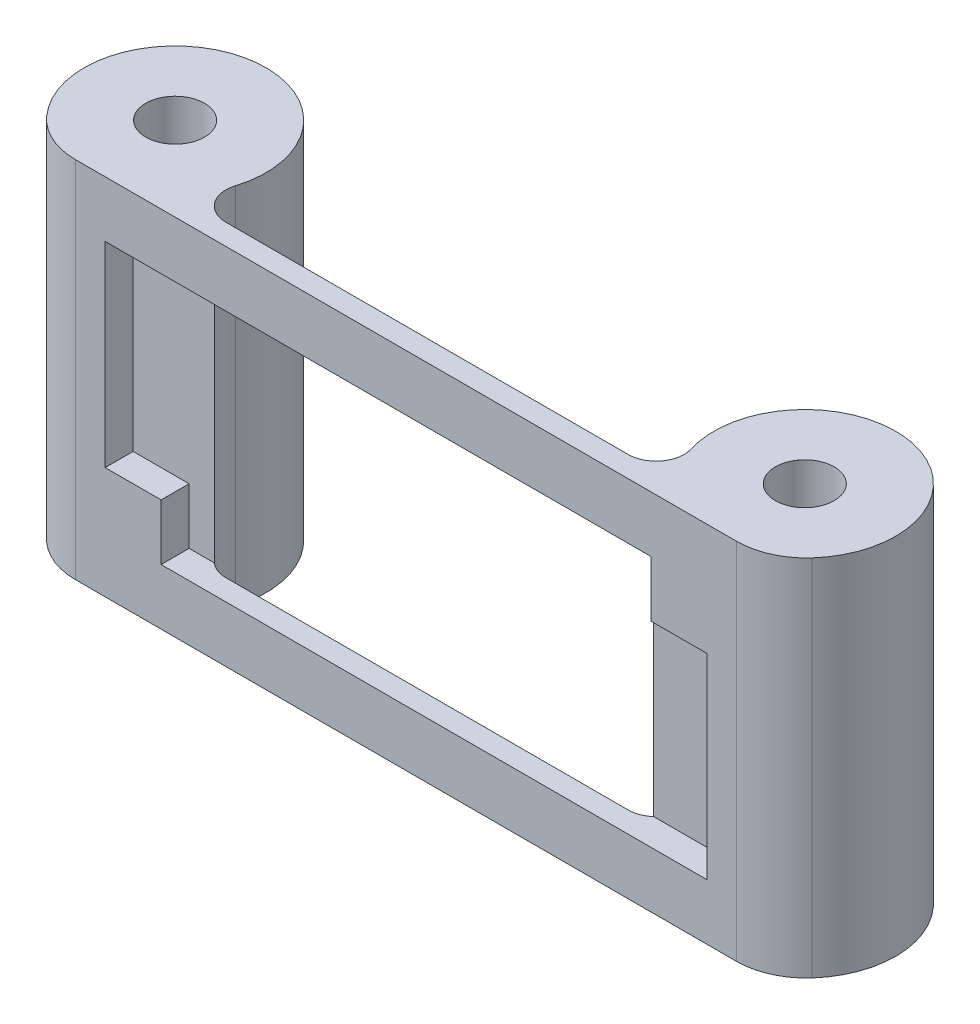
ISO-10303-21;
HEADER;
FILE_DESCRIPTION(('STEP AP214'),'2;1');
FILE_NAME('part.step','',(''),(''),'','','');
FILE_SCHEMA(('AUTOMOTIVE_DESIGN { 1 0 10303 214 1 1 1 1 }'));
ENDSEC;
DATA;
#1=APPLICATION_CONTEXT('core data for automotive mechanical design processes');
#2=APPLICATION_PROTOCOL_DEFINITION('international standard','automotive_design',2000,#1);
#3=PRODUCT_CONTEXT('',#1,'mechanical');
#4=PRODUCT('Part','Part','',(#3));
#5=PRODUCT_RELATED_PRODUCT_CATEGORY('part','',(#4));
#6=PRODUCT_DEFINITION_FORMATION('','',#4);
#7=PRODUCT_DEFINITION_CONTEXT('part definition',#1,'design');
#8=PRODUCT_DEFINITION('design','',#6,#7);
#9=PRODUCT_DEFINITION_SHAPE('','',#8);
#10=(LENGTH_UNIT() NAMED_UNIT(*) SI_UNIT(.MILLI.,.METRE.));
#11=(NAMED_UNIT(*) PLANE_ANGLE_UNIT() SI_UNIT($,.RADIAN.));
#12=(NAMED_UNIT(*) SI_UNIT($,.STERADIAN.) SOLID_ANGLE_UNIT());
#13=UNCERTAINTY_MEASURE_WITH_UNIT(LENGTH_MEASURE(1.E-05),#10,'distance_accuracy_value','');
#14=(GEOMETRIC_REPRESENTATION_CONTEXT(3) GLOBAL_UNCERTAINTY_ASSIGNED_CONTEXT((#13)) GLOBAL_UNIT_ASSIGNED_CONTEXT((#10,
#11,#12)) REPRESENTATION_CONTEXT('',''));
#15=CARTESIAN_POINT('',(0.,0.,0.));
#16=DIRECTION('',(0.,0.,1.));
#17=DIRECTION('',(1.,0.,0.));
#18=AXIS2_PLACEMENT_3D('',#15,#16,#17);
#19=CARTESIAN_POINT('',(0.,0.,4.5));
#20=DIRECTION('',(0.,0.,1.));
#21=DIRECTION('',(1.,0.,0.));
#22=AXIS2_PLACEMENT_3D('',#19,#20,#21);
#23=PLANE('',#22);
#24=DIRECTION('',(0.,1.,0.));
#25=VECTOR('',#24,1.);
#26=CARTESIAN_POINT('',(36.875961595364,0.,4.5));
#27=LINE('',#26,#25);
#28=CARTESIAN_POINT('',(36.875961595364,26.,4.5));
#29=VERTEX_POINT('',#28);
#30=CARTESIAN_POINT('',(36.875961595364,22.,4.5));
#31=VERTEX_POINT('',#30);
#32=EDGE_CURVE('E274',#29,#31,#27,.F.);
#33=ORIENTED_EDGE('',*,*,#32,.T.);
#34=DIRECTION('',(-1.,0.,0.));
#35=VECTOR('',#34,1.);
#36=CARTESIAN_POINT('',(0.,22.,4.5));
#37=LINE('',#36,#35);
#38=CARTESIAN_POINT('',(8.12403840463595,22.,4.5));
#39=VERTEX_POINT('',#38);
#40=EDGE_CURVE('E233',#31,#39,#37,.T.);
#41=ORIENTED_EDGE('',*,*,#40,.T.);
#42=DIRECTION('',(0.,1.,0.));
#43=VECTOR('',#42,1.);
#44=CARTESIAN_POINT('',(8.12403840463596,26.,4.5));
#45=LINE('',#44,#43);
#46=CARTESIAN_POINT('',(8.12403840463595,26.,4.5));
#47=VERTEX_POINT('',#46);
#48=EDGE_CURVE('E277',#39,#47,#45,.T.);
#49=ORIENTED_EDGE('',*,*,#48,.T.);
#50=DIRECTION('',(-1.,0.,0.));
#51=VECTOR('',#50,1.);
#52=CARTESIAN_POINT('',(-2.5,26.,4.5));
#53=LINE('',#52,#51);
#54=EDGE_CURVE('E252',#29,#47,#53,.T.);
#55=ORIENTED_EDGE('',*,*,#54,.F.);
#56=EDGE_LOOP('',(#33,#41,#49,#55));
#57=FACE_BOUND('',#56,.T.);
#58=ADVANCED_FACE('F17',(#57),#23,.F.);
#59=CARTESIAN_POINT('',(8.12403840463595,0.,4.5));
#60=VERTEX_POINT('',#59);
#61=CARTESIAN_POINT('',(8.12403840463595,4.,4.5));
#62=VERTEX_POINT('',#61);
#63=EDGE_CURVE('E278',#60,#62,#45,.T.);
#64=ORIENTED_EDGE('',*,*,#63,.T.);
#65=DIRECTION('',(1.,0.,0.));
#66=VECTOR('',#65,1.);
#67=CARTESIAN_POINT('',(0.,4.,4.5));
#68=LINE('',#67,#66);
#69=CARTESIAN_POINT('',(36.875961595364,4.,4.5));
#70=VERTEX_POINT('',#69);
#71=EDGE_CURVE('E227',#62,#70,#68,.T.);
#72=ORIENTED_EDGE('',*,*,#71,.T.);
#73=CARTESIAN_POINT('',(36.875961595364,0.,4.5));
#74=VERTEX_POINT('',#73);
#75=EDGE_CURVE('E271',#70,#74,#27,.F.);
#76=ORIENTED_EDGE('',*,*,#75,.T.);
#77=DIRECTION('',(1.,0.,0.));
#78=VECTOR('',#77,1.);
#79=CARTESIAN_POINT('',(-2.5,0.,4.5));
#80=LINE('',#79,#78);
#81=EDGE_CURVE('E248',#60,#74,#80,.T.);
#82=ORIENTED_EDGE('',*,*,#81,.F.);
#83=EDGE_LOOP('',(#64,#72,#76,#82));
#84=FACE_BOUND('',#83,.T.);
#85=ADVANCED_FACE('F326',(#84),#23,.F.);
#86=CARTESIAN_POINT('',(0.,26.,0.));
#87=DIRECTION('',(0.,-1.,0.));
#88=DIRECTION('',(0.,0.,-1.));
#89=AXIS2_PLACEMENT_3D('',#86,#87,#88);
#90=CYLINDRICAL_SURFACE('',#89,6.5);
#91=CARTESIAN_POINT('',(0.,0.,0.));
#92=DIRECTION('',(0.,1.,0.));
#93=DIRECTION('',(0.,0.,1.));
#94=AXIS2_PLACEMENT_3D('',#91,#92,#93);
#95=CIRCLE('',#94,6.5);
#96=CARTESIAN_POINT('',(6.21249995648632,0.,1.91176470588236));
#97=VERTEX_POINT('',#96);
#98=CARTESIAN_POINT('',(-4.84481395124954,0.,4.33333333333334));
#99=VERTEX_POINT('',#98);
#100=EDGE_CURVE('E265',#97,#99,#95,.T.);
#101=ORIENTED_EDGE('',*,*,#100,.T.);
#102=DIRECTION('',(0.,-1.,0.));
#103=VECTOR('',#102,1.);
#104=CARTESIAN_POINT('',(-4.84481395124954,26.,4.33333333333334));
#105=LINE('',#104,#103);
#106=CARTESIAN_POINT('',(-4.84481395124954,26.,4.33333333333334));
#107=VERTEX_POINT('',#106);
#108=EDGE_CURVE('E311',#99,#107,#105,.F.);
#109=ORIENTED_EDGE('',*,*,#108,.T.);
#110=CARTESIAN_POINT('',(0.,26.,0.));
#111=DIRECTION('',(0.,1.,0.));
#112=DIRECTION('',(0.,0.,1.));
#113=AXIS2_PLACEMENT_3D('',#110,#111,#112);
#114=CIRCLE('',#113,6.5);
#115=CARTESIAN_POINT('',(6.21249995648632,26.,1.91176470588236));
#116=VERTEX_POINT('',#115);
#117=EDGE_CURVE('E268',#116,#107,#114,.T.);
#118=ORIENTED_EDGE('',*,*,#117,.F.);
#119=DIRECTION('',(0.,-1.,0.));
#120=VECTOR('',#119,1.);
#121=CARTESIAN_POINT('',(6.21249995648632,26.,1.91176470588236));
#122=LINE('',#121,#120);
#123=EDGE_CURVE('E281',#116,#97,#122,.T.);
#124=ORIENTED_EDGE('',*,*,#123,.T.);
#125=EDGE_LOOP('',(#101,#109,#118,#124));
#126=FACE_BOUND('',#125,.T.);
#127=ADVANCED_FACE('F381',(#126),#90,.T.);
#128=CARTESIAN_POINT('',(0.,26.,0.));
#129=DIRECTION('',(0.,1.,0.));
#130=DIRECTION('',(0.,0.,1.));
#131=AXIS2_PLACEMENT_3D('',#128,#129,#130);
#132=PLANE('',#131);
#133=DIRECTION('',(1.,0.,0.));
#134=VECTOR('',#133,1.);
#135=CARTESIAN_POINT('',(0.,26.,6.));
#136=LINE('',#135,#134);
#137=CARTESIAN_POINT('',(-1.11803398874989,26.,6.));
#138=VERTEX_POINT('',#137);
#139=CARTESIAN_POINT('',(46.1180339887499,26.,6.));
#140=VERTEX_POINT('',#139);
#141=EDGE_CURVE('E258',#138,#140,#136,.T.);
#142=ORIENTED_EDGE('',*,*,#141,.T.);
#143=CARTESIAN_POINT('',(46.1180339887499,26.,1.));
#144=DIRECTION('',(0.,1.,0.));
#145=DIRECTION('',(0.,0.,1.));
#146=AXIS2_PLACEMENT_3D('',#143,#144,#145);
#147=CIRCLE('',#146,5.);
#148=CARTESIAN_POINT('',(49.8448139512495,26.,4.33333333333334));
#149=VERTEX_POINT('',#148);
#150=EDGE_CURVE('E303',#140,#149,#147,.T.);
#151=ORIENTED_EDGE('',*,*,#150,.T.);
#152=CARTESIAN_POINT('',(45.,26.,0.));
#153=DIRECTION('',(0.,1.,0.));
#154=DIRECTION('',(0.,0.,1.));
#155=AXIS2_PLACEMENT_3D('',#152,#153,#154);
#156=CIRCLE('',#155,6.5);
#157=CARTESIAN_POINT('',(38.7875000435137,26.,1.91176470588236));
#158=VERTEX_POINT('',#157);
#159=EDGE_CURVE('E246',#149,#158,#156,.T.);
#160=ORIENTED_EDGE('',*,*,#159,.T.);
#161=CARTESIAN_POINT('',(36.875961595364,26.,2.5));
#162=DIRECTION('',(0.,1.,0.));
#163=DIRECTION('',(0.,0.,1.));
#164=AXIS2_PLACEMENT_3D('',#161,#162,#163);
#165=CIRCLE('',#164,2.);
#166=EDGE_CURVE('E290',#158,#29,#165,.F.);
#167=ORIENTED_EDGE('',*,*,#166,.T.);
#168=ORIENTED_EDGE('',*,*,#54,.T.);
#169=CARTESIAN_POINT('',(8.12403840463596,26.,2.5));
#170=DIRECTION('',(0.,1.,0.));
#171=DIRECTION('',(0.,0.,1.));
#172=AXIS2_PLACEMENT_3D('',#169,#170,#171);
#173=CIRCLE('',#172,2.);
#174=EDGE_CURVE('E286',#47,#116,#173,.F.);
#175=ORIENTED_EDGE('',*,*,#174,.T.);
#176=ORIENTED_EDGE('',*,*,#117,.T.);
#177=CARTESIAN_POINT('',(-1.11803398874989,26.,1.));
#178=DIRECTION('',(0.,1.,0.));
#179=DIRECTION('',(0.,0.,1.));
#180=AXIS2_PLACEMENT_3D('',#177,#178,#179);
#181=CIRCLE('',#180,5.);
#182=EDGE_CURVE('E301',#107,#138,#181,.T.);
#183=ORIENTED_EDGE('',*,*,#182,.T.);
#184=EDGE_LOOP('',(#142,#151,#160,#167,#168,#175,#176,#183));
#185=FACE_BOUND('',#184,.T.);
#186=CARTESIAN_POINT('',(45.,26.,0.));
#187=DIRECTION('',(0.,1.,0.));
#188=DIRECTION('',(0.,0.,1.));
#189=AXIS2_PLACEMENT_3D('',#186,#187,#188);
#190=CIRCLE('',#189,2.1);
#191=CARTESIAN_POINT('',(45.,26.,2.1));
#192=VERTEX_POINT('',#191);
#193=EDGE_CURVE('E240',#192,#192,#190,.T.);
#194=ORIENTED_EDGE('',*,*,#193,.F.);
#195=EDGE_LOOP('',(#194));
#196=FACE_BOUND('',#195,.T.);
#197=CARTESIAN_POINT('',(0.,26.,0.));
#198=DIRECTION('',(0.,1.,0.));
#199=DIRECTION('',(0.,0.,1.));
#200=AXIS2_PLACEMENT_3D('',#197,#198,#199);
#201=CIRCLE('',#200,2.1);
#202=CARTESIAN_POINT('',(0.,26.,2.1));
#203=VERTEX_POINT('',#202);
#204=EDGE_CURVE('E262',#203,#203,#201,.T.);
#205=ORIENTED_EDGE('',*,*,#204,.F.);
#206=EDGE_LOOP('',(#205));
#207=FACE_BOUND('',#206,.T.);
#208=ADVANCED_FACE('F364',(#185,#196,#207),#132,.T.);
#209=CARTESIAN_POINT('',(0.,0.,0.));
#210=DIRECTION('',(0.,1.,0.));
#211=DIRECTION('',(0.,0.,1.));
#212=AXIS2_PLACEMENT_3D('',#209,#210,#211);
#213=PLANE('',#212);
#214=CARTESIAN_POINT('',(45.,0.,0.));
#215=DIRECTION('',(0.,1.,0.));
#216=DIRECTION('',(0.,0.,1.));
#217=AXIS2_PLACEMENT_3D('',#214,#215,#216);
#218=CIRCLE('',#217,6.5);
#219=CARTESIAN_POINT('',(49.8448139512495,0.,4.33333333333334));
#220=VERTEX_POINT('',#219);
#221=CARTESIAN_POINT('',(38.7875000435137,0.,1.91176470588236));
#222=VERTEX_POINT('',#221);
#223=EDGE_CURVE('E243',#220,#222,#218,.T.);
#224=ORIENTED_EDGE('',*,*,#223,.F.);
#225=CARTESIAN_POINT('',(46.1180339887499,0.,1.));
#226=DIRECTION('',(0.,1.,0.));
#227=DIRECTION('',(0.,0.,1.));
#228=AXIS2_PLACEMENT_3D('',#225,#226,#227);
#229=CIRCLE('',#228,5.);
#230=CARTESIAN_POINT('',(46.1180339887499,0.,6.));
#231=VERTEX_POINT('',#230);
#232=EDGE_CURVE('E309',#220,#231,#229,.F.);
#233=ORIENTED_EDGE('',*,*,#232,.T.);
#234=DIRECTION('',(1.,0.,0.));
#235=VECTOR('',#234,1.);
#236=CARTESIAN_POINT('',(0.,0.,6.));
#237=LINE('',#236,#235);
#238=CARTESIAN_POINT('',(-1.11803398874989,0.,6.));
#239=VERTEX_POINT('',#238);
#240=EDGE_CURVE('E255',#239,#231,#237,.T.);
#241=ORIENTED_EDGE('',*,*,#240,.F.);
#242=CARTESIAN_POINT('',(-1.11803398874989,0.,1.));
#243=DIRECTION('',(0.,1.,0.));
#244=DIRECTION('',(0.,0.,1.));
#245=AXIS2_PLACEMENT_3D('',#242,#243,#244);
#246=CIRCLE('',#245,5.);
#247=EDGE_CURVE('E307',#239,#99,#246,.F.);
#248=ORIENTED_EDGE('',*,*,#247,.T.);
#249=ORIENTED_EDGE('',*,*,#100,.F.);
#250=CARTESIAN_POINT('',(8.12403840463596,0.,2.5));
#251=DIRECTION('',(0.,1.,0.));
#252=DIRECTION('',(0.,0.,1.));
#253=AXIS2_PLACEMENT_3D('',#250,#251,#252);
#254=CIRCLE('',#253,2.);
#255=EDGE_CURVE('E288',#97,#60,#254,.T.);
#256=ORIENTED_EDGE('',*,*,#255,.T.);
#257=ORIENTED_EDGE('',*,*,#81,.T.);
#258=CARTESIAN_POINT('',(36.875961595364,0.,2.5));
#259=DIRECTION('',(0.,1.,0.));
#260=DIRECTION('',(0.,0.,1.));
#261=AXIS2_PLACEMENT_3D('',#258,#259,#260);
#262=CIRCLE('',#261,2.);
#263=EDGE_CURVE('E292',#74,#222,#262,.T.);
#264=ORIENTED_EDGE('',*,*,#263,.T.);
#265=EDGE_LOOP('',(#224,#233,#241,#248,#249,#256,#257,#264));
#266=FACE_BOUND('',#265,.T.);
#267=CARTESIAN_POINT('',(45.,0.,0.));
#268=DIRECTION('',(0.,1.,0.));
#269=DIRECTION('',(0.,0.,1.));
#270=AXIS2_PLACEMENT_3D('',#267,#268,#269);
#271=CIRCLE('',#270,2.1);
#272=CARTESIAN_POINT('',(45.,0.,2.1));
#273=VERTEX_POINT('',#272);
#274=EDGE_CURVE('E239',#273,#273,#271,.T.);
#275=ORIENTED_EDGE('',*,*,#274,.T.);
#276=EDGE_LOOP('',(#275));
#277=FACE_BOUND('',#276,.T.);
#278=CARTESIAN_POINT('',(0.,0.,0.));
#279=DIRECTION('',(0.,1.,0.));
#280=DIRECTION('',(0.,0.,1.));
#281=AXIS2_PLACEMENT_3D('',#278,#279,#280);
#282=CIRCLE('',#281,2.1);
#283=CARTESIAN_POINT('',(0.,0.,2.1));
#284=VERTEX_POINT('',#283);
#285=EDGE_CURVE('E261',#284,#284,#282,.T.);
#286=ORIENTED_EDGE('',*,*,#285,.T.);
#287=EDGE_LOOP('',(#286));
#288=FACE_BOUND('',#287,.T.);
#289=ADVANCED_FACE('F375',(#266,#277,#288),#213,.F.);
#290=CARTESIAN_POINT('',(0.,26.,0.));
#291=DIRECTION('',(0.,-1.,0.));
#292=DIRECTION('',(0.,0.,-1.));
#293=AXIS2_PLACEMENT_3D('',#290,#291,#292);
#294=CYLINDRICAL_SURFACE('',#293,2.1);
#295=ORIENTED_EDGE('',*,*,#204,.T.);
#296=EDGE_LOOP('',(#295));
#297=FACE_BOUND('',#296,.T.);
#298=ORIENTED_EDGE('',*,*,#285,.F.);
#299=EDGE_LOOP('',(#298));
#300=FACE_BOUND('',#299,.T.);
#301=ADVANCED_FACE('F406',(#297,#300),#294,.F.);
#302=CARTESIAN_POINT('',(-23.2632016672056,52.,6.));
#303=DIRECTION('',(0.,0.,1.));
#304=DIRECTION('',(1.,0.,0.));
#305=AXIS2_PLACEMENT_3D('',#302,#303,#304);
#306=PLANE('',#305);
#307=DIRECTION('',(0.,-1.,0.));
#308=VECTOR('',#307,1.);
#309=CARTESIAN_POINT('',(1.,22.,6.));
#310=LINE('',#309,#308);
#311=CARTESIAN_POINT('',(1.,22.,6.));
#312=VERTEX_POINT('',#311);
#313=CARTESIAN_POINT('',(1.,8.,6.));
#314=VERTEX_POINT('',#313);
#315=EDGE_CURVE('E32',#312,#314,#310,.T.);
#316=ORIENTED_EDGE('',*,*,#315,.F.);
#317=DIRECTION('',(-1.,0.,0.));
#318=VECTOR('',#317,1.);
#319=CARTESIAN_POINT('',(1.,22.,6.));
#320=LINE('',#319,#318);
#321=CARTESIAN_POINT('',(40.,22.,6.));
#322=VERTEX_POINT('',#321);
#323=EDGE_CURVE('E175',#322,#312,#320,.T.);
#324=ORIENTED_EDGE('',*,*,#323,.F.);
#325=DIRECTION('',(0.,1.,0.));
#326=VECTOR('',#325,1.);
#327=CARTESIAN_POINT('',(40.,22.,6.));
#328=LINE('',#327,#326);
#329=CARTESIAN_POINT('',(40.,18.,6.));
#330=VERTEX_POINT('',#329);
#331=EDGE_CURVE('E178',#330,#322,#328,.T.);
#332=ORIENTED_EDGE('',*,*,#331,.F.);
#333=DIRECTION('',(-1.,0.,0.));
#334=VECTOR('',#333,1.);
#335=CARTESIAN_POINT('',(40.,18.,6.));
#336=LINE('',#335,#334);
#337=CARTESIAN_POINT('',(44.,18.,6.));
#338=VERTEX_POINT('',#337);
#339=EDGE_CURVE('E207',#338,#330,#336,.T.);
#340=ORIENTED_EDGE('',*,*,#339,.F.);
#341=DIRECTION('',(0.,1.,0.));
#342=VECTOR('',#341,1.);
#343=CARTESIAN_POINT('',(44.,18.,6.));
#344=LINE('',#343,#342);
#345=CARTESIAN_POINT('',(44.,4.,6.));
#346=VERTEX_POINT('',#345);
#347=EDGE_CURVE('E204',#346,#338,#344,.T.);
#348=ORIENTED_EDGE('',*,*,#347,.F.);
#349=DIRECTION('',(1.,0.,0.));
#350=VECTOR('',#349,1.);
#351=CARTESIAN_POINT('',(5.,4.,6.));
#352=LINE('',#351,#350);
#353=CARTESIAN_POINT('',(5.,4.,6.));
#354=VERTEX_POINT('',#353);
#355=EDGE_CURVE('E201',#354,#346,#352,.T.);
#356=ORIENTED_EDGE('',*,*,#355,.F.);
#357=DIRECTION('',(0.,-1.,0.));
#358=VECTOR('',#357,1.);
#359=CARTESIAN_POINT('',(5.,8.,6.));
#360=LINE('',#359,#358);
#361=CARTESIAN_POINT('',(5.,8.,6.));
#362=VERTEX_POINT('',#361);
#363=EDGE_CURVE('E198',#362,#354,#360,.T.);
#364=ORIENTED_EDGE('',*,*,#363,.F.);
#365=DIRECTION('',(1.,0.,0.));
#366=VECTOR('',#365,1.);
#367=CARTESIAN_POINT('',(1.,8.,6.));
#368=LINE('',#367,#366);
#369=EDGE_CURVE('E196',#314,#362,#368,.T.);
#370=ORIENTED_EDGE('',*,*,#369,.F.);
#371=EDGE_LOOP('',(#316,#324,#332,#340,#348,#356,#364,#370));
#372=FACE_BOUND('',#371,.T.);
#373=ORIENTED_EDGE('',*,*,#240,.T.);
#374=DIRECTION('',(0.,1.,0.));
#375=VECTOR('',#374,1.);
#376=CARTESIAN_POINT('',(46.1180339887499,26.,6.));
#377=LINE('',#376,#375);
#378=EDGE_CURVE('E298',#231,#140,#377,.T.);
#379=ORIENTED_EDGE('',*,*,#378,.T.);
#380=ORIENTED_EDGE('',*,*,#141,.F.);
#381=DIRECTION('',(0.,1.,0.));
#382=VECTOR('',#381,1.);
#383=CARTESIAN_POINT('',(-1.11803398874989,0.,6.));
#384=LINE('',#383,#382);
#385=EDGE_CURVE('E295',#138,#239,#384,.F.);
#386=ORIENTED_EDGE('',*,*,#385,.T.);
#387=EDGE_LOOP('',(#373,#379,#380,#386));
#388=FACE_BOUND('',#387,.T.);
#389=ADVANCED_FACE('F343',(#372,#388),#306,.T.);
#390=CARTESIAN_POINT('',(45.,26.,0.));
#391=DIRECTION('',(0.,-1.,0.));
#392=DIRECTION('',(0.,0.,-1.));
#393=AXIS2_PLACEMENT_3D('',#390,#391,#392);
#394=CYLINDRICAL_SURFACE('',#393,6.5);
#395=ORIENTED_EDGE('',*,*,#159,.F.);
#396=DIRECTION('',(0.,-1.,0.));
#397=VECTOR('',#396,1.);
#398=CARTESIAN_POINT('',(49.8448139512495,26.,4.33333333333334));
#399=LINE('',#398,#397);
#400=EDGE_CURVE('E305',#149,#220,#399,.T.);
#401=ORIENTED_EDGE('',*,*,#400,.T.);
#402=ORIENTED_EDGE('',*,*,#223,.T.);
#403=DIRECTION('',(0.,-1.,0.));
#404=VECTOR('',#403,1.);
#405=CARTESIAN_POINT('',(38.7875000435137,26.,1.91176470588236));
#406=LINE('',#405,#404);
#407=EDGE_CURVE('E283',#222,#158,#406,.F.);
#408=ORIENTED_EDGE('',*,*,#407,.T.);
#409=EDGE_LOOP('',(#395,#401,#402,#408));
#410=FACE_BOUND('',#409,.T.);
#411=ADVANCED_FACE('F370',(#410),#394,.T.);
#412=CARTESIAN_POINT('',(45.,26.,0.));
#413=DIRECTION('',(0.,-1.,0.));
#414=DIRECTION('',(0.,0.,-1.));
#415=AXIS2_PLACEMENT_3D('',#412,#413,#414);
#416=CYLINDRICAL_SURFACE('',#415,2.1);
#417=ORIENTED_EDGE('',*,*,#193,.T.);
#418=EDGE_LOOP('',(#417));
#419=FACE_BOUND('',#418,.T.);
#420=ORIENTED_EDGE('',*,*,#274,.F.);
#421=EDGE_LOOP('',(#420));
#422=FACE_BOUND('',#421,.T.);
#423=ADVANCED_FACE('F417',(#419,#422),#416,.F.);
#424=CARTESIAN_POINT('',(8.12403840463596,26.,2.5));
#425=DIRECTION('',(0.,-1.,0.));
#426=DIRECTION('',(0.,0.,-1.));
#427=AXIS2_PLACEMENT_3D('',#424,#425,#426);
#428=CYLINDRICAL_SURFACE('',#427,2.);
#429=ORIENTED_EDGE('',*,*,#48,.F.);
#430=CARTESIAN_POINT('',(8.12403840463596,22.,2.5));
#431=DIRECTION('',(0.,1.,0.));
#432=DIRECTION('',(0.,0.,1.));
#433=AXIS2_PLACEMENT_3D('',#430,#431,#432);
#434=CIRCLE('',#433,2.);
#435=CARTESIAN_POINT('',(6.80116274910366,22.,4.));
#436=VERTEX_POINT('',#435);
#437=EDGE_CURVE('E236',#39,#436,#434,.F.);
#438=ORIENTED_EDGE('',*,*,#437,.T.);
#439=DIRECTION('',(0.,-1.,0.));
#440=VECTOR('',#439,1.);
#441=CARTESIAN_POINT('',(6.80116274910366,26.,4.));
#442=LINE('',#441,#440);
#443=CARTESIAN_POINT('',(6.80116274910366,4.,4.));
#444=VERTEX_POINT('',#443);
#445=EDGE_CURVE('E214',#444,#436,#442,.F.);
#446=ORIENTED_EDGE('',*,*,#445,.F.);
#447=CARTESIAN_POINT('',(8.12403840463596,4.,2.5));
#448=DIRECTION('',(0.,-1.,0.));
#449=DIRECTION('',(1.,0.,0.));
#450=AXIS2_PLACEMENT_3D('',#447,#448,#449);
#451=CIRCLE('',#450,2.);
#452=EDGE_CURVE('E230',#444,#62,#451,.F.);
#453=ORIENTED_EDGE('',*,*,#452,.T.);
#454=ORIENTED_EDGE('',*,*,#63,.F.);
#455=ORIENTED_EDGE('',*,*,#255,.F.);
#456=ORIENTED_EDGE('',*,*,#123,.F.);
#457=ORIENTED_EDGE('',*,*,#174,.F.);
#458=EDGE_LOOP('',(#429,#438,#446,#453,#454,#455,#456,#457));
#459=FACE_BOUND('',#458,.T.);
#460=ADVANCED_FACE('F332',(#459),#428,.F.);
#461=CARTESIAN_POINT('',(36.875961595364,26.,2.5));
#462=DIRECTION('',(0.,-1.,0.));
#463=DIRECTION('',(0.,0.,-1.));
#464=AXIS2_PLACEMENT_3D('',#461,#462,#463);
#465=CYLINDRICAL_SURFACE('',#464,2.);
#466=DIRECTION('',(0.,-1.,0.));
#467=VECTOR('',#466,1.);
#468=CARTESIAN_POINT('',(38.1988372508964,26.,4.));
#469=LINE('',#468,#467);
#470=CARTESIAN_POINT('',(38.1988372508964,22.,4.));
#471=VERTEX_POINT('',#470);
#472=CARTESIAN_POINT('',(38.1988372508964,4.,4.));
#473=VERTEX_POINT('',#472);
#474=EDGE_CURVE('E313',#471,#473,#469,.T.);
#475=ORIENTED_EDGE('',*,*,#474,.F.);
#476=CARTESIAN_POINT('',(36.875961595364,22.,2.5));
#477=DIRECTION('',(0.,1.,0.));
#478=DIRECTION('',(0.,0.,1.));
#479=AXIS2_PLACEMENT_3D('',#476,#477,#478);
#480=CIRCLE('',#479,2.);
#481=EDGE_CURVE('E11',#471,#31,#480,.F.);
#482=ORIENTED_EDGE('',*,*,#481,.T.);
#483=ORIENTED_EDGE('',*,*,#32,.F.);
#484=ORIENTED_EDGE('',*,*,#166,.F.);
#485=ORIENTED_EDGE('',*,*,#407,.F.);
#486=ORIENTED_EDGE('',*,*,#263,.F.);
#487=ORIENTED_EDGE('',*,*,#75,.F.);
#488=CARTESIAN_POINT('',(36.875961595364,4.,2.5));
#489=DIRECTION('',(0.,-1.,0.));
#490=DIRECTION('',(1.,0.,0.));
#491=AXIS2_PLACEMENT_3D('',#488,#489,#490);
#492=CIRCLE('',#491,2.);
#493=EDGE_CURVE('E25',#70,#473,#492,.F.);
#494=ORIENTED_EDGE('',*,*,#493,.T.);
#495=EDGE_LOOP('',(#475,#482,#483,#484,#485,#486,#487,#494));
#496=FACE_BOUND('',#495,.T.);
#497=ADVANCED_FACE('F318',(#496),#465,.F.);
#498=CARTESIAN_POINT('',(46.1180339887499,26.,1.));
#499=DIRECTION('',(0.,-1.,0.));
#500=DIRECTION('',(0.,0.,-1.));
#501=AXIS2_PLACEMENT_3D('',#498,#499,#500);
#502=CYLINDRICAL_SURFACE('',#501,5.);
#503=ORIENTED_EDGE('',*,*,#232,.F.);
#504=ORIENTED_EDGE('',*,*,#400,.F.);
#505=ORIENTED_EDGE('',*,*,#150,.F.);
#506=ORIENTED_EDGE('',*,*,#378,.F.);
#507=EDGE_LOOP('',(#503,#504,#505,#506));
#508=FACE_BOUND('',#507,.T.);
#509=ADVANCED_FACE('F388',(#508),#502,.T.);
#510=CARTESIAN_POINT('',(-1.11803398874989,26.,1.));
#511=DIRECTION('',(0.,-1.,0.));
#512=DIRECTION('',(0.,0.,-1.));
#513=AXIS2_PLACEMENT_3D('',#510,#511,#512);
#514=CYLINDRICAL_SURFACE('',#513,5.);
#515=ORIENTED_EDGE('',*,*,#182,.F.);
#516=ORIENTED_EDGE('',*,*,#108,.F.);
#517=ORIENTED_EDGE('',*,*,#247,.F.);
#518=ORIENTED_EDGE('',*,*,#385,.F.);
#519=EDGE_LOOP('',(#515,#516,#517,#518));
#520=FACE_BOUND('',#519,.T.);
#521=ADVANCED_FACE('F19',(#520),#514,.T.);
#522=CARTESIAN_POINT('',(1.,22.,4.));
#523=DIRECTION('',(0.,1.,0.));
#524=DIRECTION('',(0.,0.,1.));
#525=AXIS2_PLACEMENT_3D('',#522,#523,#524);
#526=PLANE('',#525);
#527=ORIENTED_EDGE('',*,*,#40,.F.);
#528=ORIENTED_EDGE('',*,*,#481,.F.);
#529=DIRECTION('',(-1.,0.,0.));
#530=VECTOR('',#529,1.);
#531=CARTESIAN_POINT('',(1.,22.,4.));
#532=LINE('',#531,#530);
#533=CARTESIAN_POINT('',(40.,22.,4.));
#534=VERTEX_POINT('',#533);
#535=EDGE_CURVE('E40',#534,#471,#532,.T.);
#536=ORIENTED_EDGE('',*,*,#535,.F.);
#537=DIRECTION('',(0.,0.,1.));
#538=VECTOR('',#537,1.);
#539=CARTESIAN_POINT('',(40.,22.,4.));
#540=LINE('',#539,#538);
#541=EDGE_CURVE('E215',#534,#322,#540,.T.);
#542=ORIENTED_EDGE('',*,*,#541,.T.);
#543=ORIENTED_EDGE('',*,*,#323,.T.);
#544=DIRECTION('',(0.,0.,1.));
#545=VECTOR('',#544,1.);
#546=CARTESIAN_POINT('',(1.,22.,4.));
#547=LINE('',#546,#545);
#548=CARTESIAN_POINT('',(1.,22.,4.));
#549=VERTEX_POINT('',#548);
#550=EDGE_CURVE('E212',#549,#312,#547,.T.);
#551=ORIENTED_EDGE('',*,*,#550,.F.);
#552=EDGE_CURVE('E173',#436,#549,#532,.T.);
#553=ORIENTED_EDGE('',*,*,#552,.F.);
#554=ORIENTED_EDGE('',*,*,#437,.F.);
#555=EDGE_LOOP('',(#527,#528,#536,#542,#543,#551,#553,#554));
#556=FACE_BOUND('',#555,.T.);
#557=ADVANCED_FACE('F357',(#556),#526,.F.);
#558=CARTESIAN_POINT('',(5.,4.,4.));
#559=DIRECTION('',(0.,-1.,0.));
#560=DIRECTION('',(1.,0.,0.));
#561=AXIS2_PLACEMENT_3D('',#558,#559,#560);
#562=PLANE('',#561);
#563=DIRECTION('',(1.,0.,0.));
#564=VECTOR('',#563,1.);
#565=CARTESIAN_POINT('',(5.,4.,4.));
#566=LINE('',#565,#564);
#567=CARTESIAN_POINT('',(5.,4.,4.));
#568=VERTEX_POINT('',#567);
#569=EDGE_CURVE('E183',#568,#444,#566,.T.);
#570=ORIENTED_EDGE('',*,*,#569,.F.);
#571=DIRECTION('',(0.,0.,1.));
#572=VECTOR('',#571,1.);
#573=CARTESIAN_POINT('',(5.,4.,4.));
#574=LINE('',#573,#572);
#575=EDGE_CURVE('E223',#568,#354,#574,.T.);
#576=ORIENTED_EDGE('',*,*,#575,.T.);
#577=ORIENTED_EDGE('',*,*,#355,.T.);
#578=DIRECTION('',(0.,0.,1.));
#579=VECTOR('',#578,1.);
#580=CARTESIAN_POINT('',(44.,4.,4.));
#581=LINE('',#580,#579);
#582=CARTESIAN_POINT('',(44.,4.,4.));
#583=VERTEX_POINT('',#582);
#584=EDGE_CURVE('E221',#583,#346,#581,.T.);
#585=ORIENTED_EDGE('',*,*,#584,.F.);
#586=EDGE_CURVE('E182',#473,#583,#566,.T.);
#587=ORIENTED_EDGE('',*,*,#586,.F.);
#588=ORIENTED_EDGE('',*,*,#493,.F.);
#589=ORIENTED_EDGE('',*,*,#71,.F.);
#590=ORIENTED_EDGE('',*,*,#452,.F.);
#591=EDGE_LOOP('',(#570,#576,#577,#585,#587,#588,#589,#590));
#592=FACE_BOUND('',#591,.T.);
#593=ADVANCED_FACE('F323',(#592),#562,.F.);
#594=CARTESIAN_POINT('',(0.,0.,4.));
#595=DIRECTION('',(0.,0.,1.));
#596=DIRECTION('',(1.,0.,0.));
#597=AXIS2_PLACEMENT_3D('',#594,#595,#596);
#598=PLANE('',#597);
#599=ORIENTED_EDGE('',*,*,#445,.T.);
#600=ORIENTED_EDGE('',*,*,#552,.T.);
#601=DIRECTION('',(0.,-1.,0.));
#602=VECTOR('',#601,1.);
#603=CARTESIAN_POINT('',(1.,22.,4.));
#604=LINE('',#603,#602);
#605=CARTESIAN_POINT('',(1.,8.,4.));
#606=VERTEX_POINT('',#605);
#607=EDGE_CURVE('E157',#549,#606,#604,.T.);
#608=ORIENTED_EDGE('',*,*,#607,.T.);
#609=DIRECTION('',(1.,0.,0.));
#610=VECTOR('',#609,1.);
#611=CARTESIAN_POINT('',(1.,8.,4.));
#612=LINE('',#611,#610);
#613=CARTESIAN_POINT('',(5.,8.,4.));
#614=VERTEX_POINT('',#613);
#615=EDGE_CURVE('E164',#606,#614,#612,.T.);
#616=ORIENTED_EDGE('',*,*,#615,.T.);
#617=DIRECTION('',(0.,-1.,0.));
#618=VECTOR('',#617,1.);
#619=CARTESIAN_POINT('',(5.,8.,4.));
#620=LINE('',#619,#618);
#621=EDGE_CURVE('E169',#614,#568,#620,.T.);
#622=ORIENTED_EDGE('',*,*,#621,.T.);
#623=ORIENTED_EDGE('',*,*,#569,.T.);
#624=EDGE_LOOP('',(#599,#600,#608,#616,#622,#623));
#625=FACE_BOUND('',#624,.T.);
#626=ADVANCED_FACE('F171',(#625),#598,.T.);
#627=ORIENTED_EDGE('',*,*,#474,.T.);
#628=ORIENTED_EDGE('',*,*,#586,.T.);
#629=DIRECTION('',(0.,1.,0.));
#630=VECTOR('',#629,1.);
#631=CARTESIAN_POINT('',(44.,18.,4.));
#632=LINE('',#631,#630);
#633=CARTESIAN_POINT('',(44.,18.,4.));
#634=VERTEX_POINT('',#633);
#635=EDGE_CURVE('E186',#583,#634,#632,.T.);
#636=ORIENTED_EDGE('',*,*,#635,.T.);
#637=DIRECTION('',(-1.,0.,0.));
#638=VECTOR('',#637,1.);
#639=CARTESIAN_POINT('',(40.,18.,4.));
#640=LINE('',#639,#638);
#641=CARTESIAN_POINT('',(40.,18.,4.));
#642=VERTEX_POINT('',#641);
#643=EDGE_CURVE('E189',#634,#642,#640,.T.);
#644=ORIENTED_EDGE('',*,*,#643,.T.);
#645=DIRECTION('',(0.,1.,0.));
#646=VECTOR('',#645,1.);
#647=CARTESIAN_POINT('',(40.,22.,4.));
#648=LINE('',#647,#646);
#649=EDGE_CURVE('E192',#642,#534,#648,.T.);
#650=ORIENTED_EDGE('',*,*,#649,.T.);
#651=ORIENTED_EDGE('',*,*,#535,.T.);
#652=EDGE_LOOP('',(#627,#628,#636,#644,#650,#651));
#653=FACE_BOUND('',#652,.T.);
#654=ADVANCED_FACE('F349',(#653),#598,.T.);
#655=CARTESIAN_POINT('',(1.,22.,4.));
#656=DIRECTION('',(-1.,0.,0.));
#657=DIRECTION('',(0.,-1.,0.));
#658=AXIS2_PLACEMENT_3D('',#655,#656,#657);
#659=PLANE('',#658);
#660=ORIENTED_EDGE('',*,*,#315,.T.);
#661=DIRECTION('',(0.,0.,1.));
#662=VECTOR('',#661,1.);
#663=CARTESIAN_POINT('',(1.,8.,4.));
#664=LINE('',#663,#662);
#665=EDGE_CURVE('E153',#606,#314,#664,.T.);
#666=ORIENTED_EDGE('',*,*,#665,.F.);
#667=ORIENTED_EDGE('',*,*,#607,.F.);
#668=ORIENTED_EDGE('',*,*,#550,.T.);
#669=EDGE_LOOP('',(#660,#666,#667,#668));
#670=FACE_BOUND('',#669,.T.);
#671=ADVANCED_FACE('F155',(#670),#659,.F.);
#672=CARTESIAN_POINT('',(40.,22.,4.));
#673=DIRECTION('',(1.,0.,0.));
#674=DIRECTION('',(0.,0.,-1.));
#675=AXIS2_PLACEMENT_3D('',#672,#673,#674);
#676=PLANE('',#675);
#677=ORIENTED_EDGE('',*,*,#331,.T.);
#678=ORIENTED_EDGE('',*,*,#541,.F.);
#679=ORIENTED_EDGE('',*,*,#649,.F.);
#680=DIRECTION('',(0.,0.,1.));
#681=VECTOR('',#680,1.);
#682=CARTESIAN_POINT('',(40.,18.,4.));
#683=LINE('',#682,#681);
#684=EDGE_CURVE('E217',#642,#330,#683,.T.);
#685=ORIENTED_EDGE('',*,*,#684,.T.);
#686=EDGE_LOOP('',(#677,#678,#679,#685));
#687=FACE_BOUND('',#686,.T.);
#688=ADVANCED_FACE('F354',(#687),#676,.F.);
#689=CARTESIAN_POINT('',(40.,18.,4.));
#690=DIRECTION('',(0.,1.,0.));
#691=DIRECTION('',(0.,0.,1.));
#692=AXIS2_PLACEMENT_3D('',#689,#690,#691);
#693=PLANE('',#692);
#694=ORIENTED_EDGE('',*,*,#339,.T.);
#695=ORIENTED_EDGE('',*,*,#684,.F.);
#696=ORIENTED_EDGE('',*,*,#643,.F.);
#697=DIRECTION('',(0.,0.,1.));
#698=VECTOR('',#697,1.);
#699=CARTESIAN_POINT('',(44.,18.,4.));
#700=LINE('',#699,#698);
#701=EDGE_CURVE('E219',#634,#338,#700,.T.);
#702=ORIENTED_EDGE('',*,*,#701,.T.);
#703=EDGE_LOOP('',(#694,#695,#696,#702));
#704=FACE_BOUND('',#703,.T.);
#705=ADVANCED_FACE('F352',(#704),#693,.F.);
#706=CARTESIAN_POINT('',(44.,18.,4.));
#707=DIRECTION('',(1.,0.,0.));
#708=DIRECTION('',(0.,1.,0.));
#709=AXIS2_PLACEMENT_3D('',#706,#707,#708);
#710=PLANE('',#709);
#711=ORIENTED_EDGE('',*,*,#347,.T.);
#712=ORIENTED_EDGE('',*,*,#701,.F.);
#713=ORIENTED_EDGE('',*,*,#635,.F.);
#714=ORIENTED_EDGE('',*,*,#584,.T.);
#715=EDGE_LOOP('',(#711,#712,#713,#714));
#716=FACE_BOUND('',#715,.T.);
#717=ADVANCED_FACE('F347',(#716),#710,.F.);
#718=CARTESIAN_POINT('',(5.,8.,4.));
#719=DIRECTION('',(-1.,0.,0.));
#720=DIRECTION('',(0.,-1.,0.));
#721=AXIS2_PLACEMENT_3D('',#718,#719,#720);
#722=PLANE('',#721);
#723=ORIENTED_EDGE('',*,*,#363,.T.);
#724=ORIENTED_EDGE('',*,*,#575,.F.);
#725=ORIENTED_EDGE('',*,*,#621,.F.);
#726=DIRECTION('',(0.,0.,1.));
#727=VECTOR('',#726,1.);
#728=CARTESIAN_POINT('',(5.,8.,4.));
#729=LINE('',#728,#727);
#730=EDGE_CURVE('E161',#614,#362,#729,.T.);
#731=ORIENTED_EDGE('',*,*,#730,.T.);
#732=EDGE_LOOP('',(#723,#724,#725,#731));
#733=FACE_BOUND('',#732,.T.);
#734=ADVANCED_FACE('F336',(#733),#722,.F.);
#735=CARTESIAN_POINT('',(1.,8.,4.));
#736=DIRECTION('',(0.,-1.,0.));
#737=DIRECTION('',(0.,0.,-1.));
#738=AXIS2_PLACEMENT_3D('',#735,#736,#737);
#739=PLANE('',#738);
#740=ORIENTED_EDGE('',*,*,#369,.T.);
#741=ORIENTED_EDGE('',*,*,#730,.F.);
#742=ORIENTED_EDGE('',*,*,#615,.F.);
#743=ORIENTED_EDGE('',*,*,#665,.T.);
#744=EDGE_LOOP('',(#740,#741,#742,#743));
#745=FACE_BOUND('',#744,.T.);
#746=ADVANCED_FACE('F165',(#745),#739,.F.);
#747=CLOSED_SHELL('',(#58,#85,#127,#208,#289,#301,#389,#411,#423,#460,#497,#509,#521,#557,#593,
#626,#654,#671,#688,#705,#717,#734,#746));
#748=MANIFOLD_SOLID_BREP('B1',#747);
#749=ADVANCED_BREP_SHAPE_REPRESENTATION('',(#18,#748),#14);
#750=SHAPE_DEFINITION_REPRESENTATION(#9,#749);
ENDSEC;
END-ISO-10303-21;
